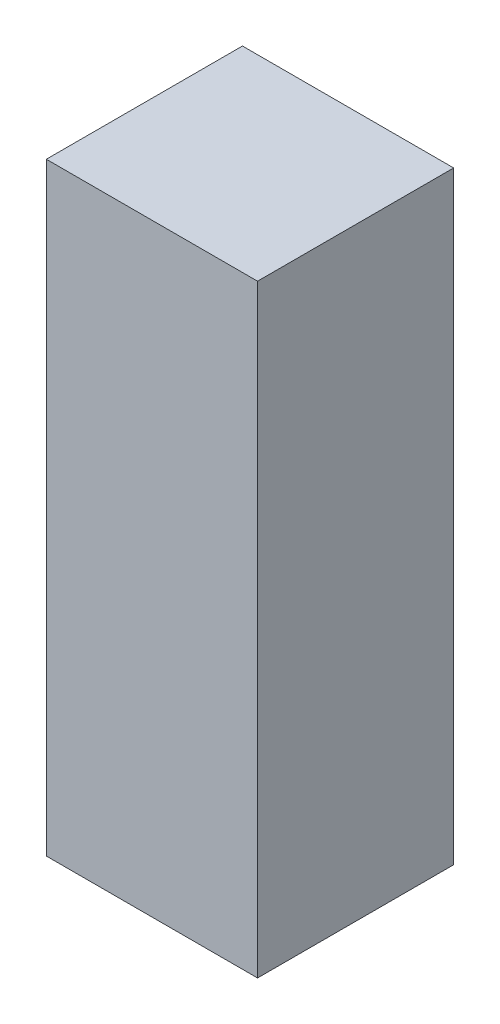
ISO-10303-21;
HEADER;
FILE_DESCRIPTION(('STEP AP214'),'2;1');
FILE_NAME('part.step','',(''),(''),'','','');
FILE_SCHEMA(('AUTOMOTIVE_DESIGN { 1 0 10303 214 1 1 1 1 }'));
ENDSEC;
DATA;
#1=APPLICATION_CONTEXT('core data for automotive mechanical design processes');
#2=APPLICATION_PROTOCOL_DEFINITION('international standard','automotive_design',2000,#1);
#3=PRODUCT_CONTEXT('',#1,'mechanical');
#4=PRODUCT('Part','Part','',(#3));
#5=PRODUCT_RELATED_PRODUCT_CATEGORY('part','',(#4));
#6=PRODUCT_DEFINITION_FORMATION('','',#4);
#7=PRODUCT_DEFINITION_CONTEXT('part definition',#1,'design');
#8=PRODUCT_DEFINITION('design','',#6,#7);
#9=PRODUCT_DEFINITION_SHAPE('','',#8);
#10=(LENGTH_UNIT() NAMED_UNIT(*) SI_UNIT(.MILLI.,.METRE.));
#11=(NAMED_UNIT(*) PLANE_ANGLE_UNIT() SI_UNIT($,.RADIAN.));
#12=(NAMED_UNIT(*) SI_UNIT($,.STERADIAN.) SOLID_ANGLE_UNIT());
#13=UNCERTAINTY_MEASURE_WITH_UNIT(LENGTH_MEASURE(1.E-05),#10,'distance_accuracy_value','');
#14=(GEOMETRIC_REPRESENTATION_CONTEXT(3) GLOBAL_UNCERTAINTY_ASSIGNED_CONTEXT((#13)) GLOBAL_UNIT_ASSIGNED_CONTEXT((#10,
#11,#12)) REPRESENTATION_CONTEXT('',''));
#15=CARTESIAN_POINT('',(0.,0.,0.));
#16=DIRECTION('',(0.,0.,1.));
#17=DIRECTION('',(1.,0.,0.));
#18=AXIS2_PLACEMENT_3D('',#15,#16,#17);
#19=CARTESIAN_POINT('',(24.,240.,33.));
#20=DIRECTION('',(1.,0.,0.));
#21=DIRECTION('',(0.,0.,-1.));
#22=AXIS2_PLACEMENT_3D('',#19,#20,#21);
#23=PLANE('',#22);
#24=DIRECTION('',(0.,-1.,0.));
#25=VECTOR('',#24,1.);
#26=CARTESIAN_POINT('',(24.,240.,20.));
#27=LINE('',#26,#25);
#28=CARTESIAN_POINT('',(24.,280.,20.));
#29=VERTEX_POINT('',#28);
#30=CARTESIAN_POINT('',(24.,240.,20.));
#31=VERTEX_POINT('',#30);
#32=EDGE_CURVE('E102',#29,#31,#27,.T.);
#33=ORIENTED_EDGE('',*,*,#32,.T.);
#34=DIRECTION('',(0.,0.,-1.));
#35=VECTOR('',#34,1.);
#36=CARTESIAN_POINT('',(24.,240.,33.));
#37=LINE('',#36,#35);
#38=CARTESIAN_POINT('',(24.,240.,33.));
#39=VERTEX_POINT('',#38);
#40=EDGE_CURVE('E11',#39,#31,#37,.T.);
#41=ORIENTED_EDGE('',*,*,#40,.F.);
#42=DIRECTION('',(0.,-1.,0.));
#43=VECTOR('',#42,1.);
#44=CARTESIAN_POINT('',(24.,240.,33.));
#45=LINE('',#44,#43);
#46=CARTESIAN_POINT('',(24.,280.,33.));
#47=VERTEX_POINT('',#46);
#48=EDGE_CURVE('E90',#47,#39,#45,.T.);
#49=ORIENTED_EDGE('',*,*,#48,.F.);
#50=DIRECTION('',(0.,0.,-1.));
#51=VECTOR('',#50,1.);
#52=CARTESIAN_POINT('',(24.,280.,33.));
#53=LINE('',#52,#51);
#54=EDGE_CURVE('E98',#47,#29,#53,.T.);
#55=ORIENTED_EDGE('',*,*,#54,.T.);
#56=EDGE_LOOP('',(#33,#41,#49,#55));
#57=FACE_BOUND('',#56,.T.);
#58=ADVANCED_FACE('F39',(#57),#23,.F.);
#59=CARTESIAN_POINT('',(24.,240.,33.));
#60=DIRECTION('',(0.,1.,0.));
#61=DIRECTION('',(0.,0.,1.));
#62=AXIS2_PLACEMENT_3D('',#59,#60,#61);
#63=PLANE('',#62);
#64=DIRECTION('',(1.,0.,0.));
#65=VECTOR('',#64,1.);
#66=CARTESIAN_POINT('',(24.,240.,20.));
#67=LINE('',#66,#65);
#68=CARTESIAN_POINT('',(38.,240.,20.));
#69=VERTEX_POINT('',#68);
#70=EDGE_CURVE('E94',#31,#69,#67,.T.);
#71=ORIENTED_EDGE('',*,*,#70,.T.);
#72=DIRECTION('',(0.,0.,-1.));
#73=VECTOR('',#72,1.);
#74=CARTESIAN_POINT('',(38.,240.,33.));
#75=LINE('',#74,#73);
#76=CARTESIAN_POINT('',(38.,240.,33.));
#77=VERTEX_POINT('',#76);
#78=EDGE_CURVE('E47',#77,#69,#75,.T.);
#79=ORIENTED_EDGE('',*,*,#78,.F.);
#80=DIRECTION('',(1.,0.,0.));
#81=VECTOR('',#80,1.);
#82=CARTESIAN_POINT('',(24.,240.,33.));
#83=LINE('',#82,#81);
#84=EDGE_CURVE('E85',#39,#77,#83,.T.);
#85=ORIENTED_EDGE('',*,*,#84,.F.);
#86=ORIENTED_EDGE('',*,*,#40,.T.);
#87=EDGE_LOOP('',(#71,#79,#85,#86));
#88=FACE_BOUND('',#87,.T.);
#89=ADVANCED_FACE('F93',(#88),#63,.F.);
#90=CARTESIAN_POINT('',(38.,240.,33.));
#91=DIRECTION('',(-1.,0.,0.));
#92=DIRECTION('',(0.,0.,1.));
#93=AXIS2_PLACEMENT_3D('',#90,#91,#92);
#94=PLANE('',#93);
#95=DIRECTION('',(0.,1.,0.));
#96=VECTOR('',#95,1.);
#97=CARTESIAN_POINT('',(38.,240.,20.));
#98=LINE('',#97,#96);
#99=CARTESIAN_POINT('',(38.,280.,20.));
#100=VERTEX_POINT('',#99);
#101=EDGE_CURVE('E72',#69,#100,#98,.T.);
#102=ORIENTED_EDGE('',*,*,#101,.T.);
#103=DIRECTION('',(0.,0.,-1.));
#104=VECTOR('',#103,1.);
#105=CARTESIAN_POINT('',(38.,280.,33.));
#106=LINE('',#105,#104);
#107=CARTESIAN_POINT('',(38.,280.,33.));
#108=VERTEX_POINT('',#107);
#109=EDGE_CURVE('E95',#108,#100,#106,.T.);
#110=ORIENTED_EDGE('',*,*,#109,.F.);
#111=DIRECTION('',(0.,1.,0.));
#112=VECTOR('',#111,1.);
#113=CARTESIAN_POINT('',(38.,240.,33.));
#114=LINE('',#113,#112);
#115=EDGE_CURVE('E88',#77,#108,#114,.T.);
#116=ORIENTED_EDGE('',*,*,#115,.F.);
#117=ORIENTED_EDGE('',*,*,#78,.T.);
#118=EDGE_LOOP('',(#102,#110,#116,#117));
#119=FACE_BOUND('',#118,.T.);
#120=ADVANCED_FACE('F96',(#119),#94,.F.);
#121=CARTESIAN_POINT('',(24.,280.,33.));
#122=DIRECTION('',(0.,-1.,0.));
#123=DIRECTION('',(0.,0.,-1.));
#124=AXIS2_PLACEMENT_3D('',#121,#122,#123);
#125=PLANE('',#124);
#126=DIRECTION('',(-1.,0.,0.));
#127=VECTOR('',#126,1.);
#128=CARTESIAN_POINT('',(24.,280.,20.));
#129=LINE('',#128,#127);
#130=EDGE_CURVE('E78',#100,#29,#129,.T.);
#131=ORIENTED_EDGE('',*,*,#130,.T.);
#132=ORIENTED_EDGE('',*,*,#54,.F.);
#133=DIRECTION('',(-1.,0.,0.));
#134=VECTOR('',#133,1.);
#135=CARTESIAN_POINT('',(24.,280.,33.));
#136=LINE('',#135,#134);
#137=EDGE_CURVE('E55',#108,#47,#136,.T.);
#138=ORIENTED_EDGE('',*,*,#137,.F.);
#139=ORIENTED_EDGE('',*,*,#109,.T.);
#140=EDGE_LOOP('',(#131,#132,#138,#139));
#141=FACE_BOUND('',#140,.T.);
#142=ADVANCED_FACE('F109',(#141),#125,.F.);
#143=CARTESIAN_POINT('',(0.,0.,33.));
#144=DIRECTION('',(0.,0.,-1.));
#145=DIRECTION('',(-1.,0.,0.));
#146=AXIS2_PLACEMENT_3D('',#143,#144,#145);
#147=PLANE('',#146);
#148=ORIENTED_EDGE('',*,*,#48,.T.);
#149=ORIENTED_EDGE('',*,*,#84,.T.);
#150=ORIENTED_EDGE('',*,*,#115,.T.);
#151=ORIENTED_EDGE('',*,*,#137,.T.);
#152=EDGE_LOOP('',(#148,#149,#150,#151));
#153=FACE_BOUND('',#152,.T.);
#154=ADVANCED_FACE('F86',(#153),#147,.F.);
#155=CARTESIAN_POINT('',(0.,0.,20.));
#156=DIRECTION('',(0.,0.,-1.));
#157=DIRECTION('',(-1.,0.,0.));
#158=AXIS2_PLACEMENT_3D('',#155,#156,#157);
#159=PLANE('',#158);
#160=ORIENTED_EDGE('',*,*,#32,.F.);
#161=ORIENTED_EDGE('',*,*,#130,.F.);
#162=ORIENTED_EDGE('',*,*,#101,.F.);
#163=ORIENTED_EDGE('',*,*,#70,.F.);
#164=EDGE_LOOP('',(#160,#161,#162,#163));
#165=FACE_BOUND('',#164,.T.);
#166=ADVANCED_FACE('F112',(#165),#159,.T.);
#167=CLOSED_SHELL('',(#58,#89,#120,#142,#154,#166));
#168=MANIFOLD_SOLID_BREP('B2',#167);
#169=ADVANCED_BREP_SHAPE_REPRESENTATION('',(#18,#168),#14);
#170=SHAPE_DEFINITION_REPRESENTATION(#9,#169);
ENDSEC;
END-ISO-10303-21;
